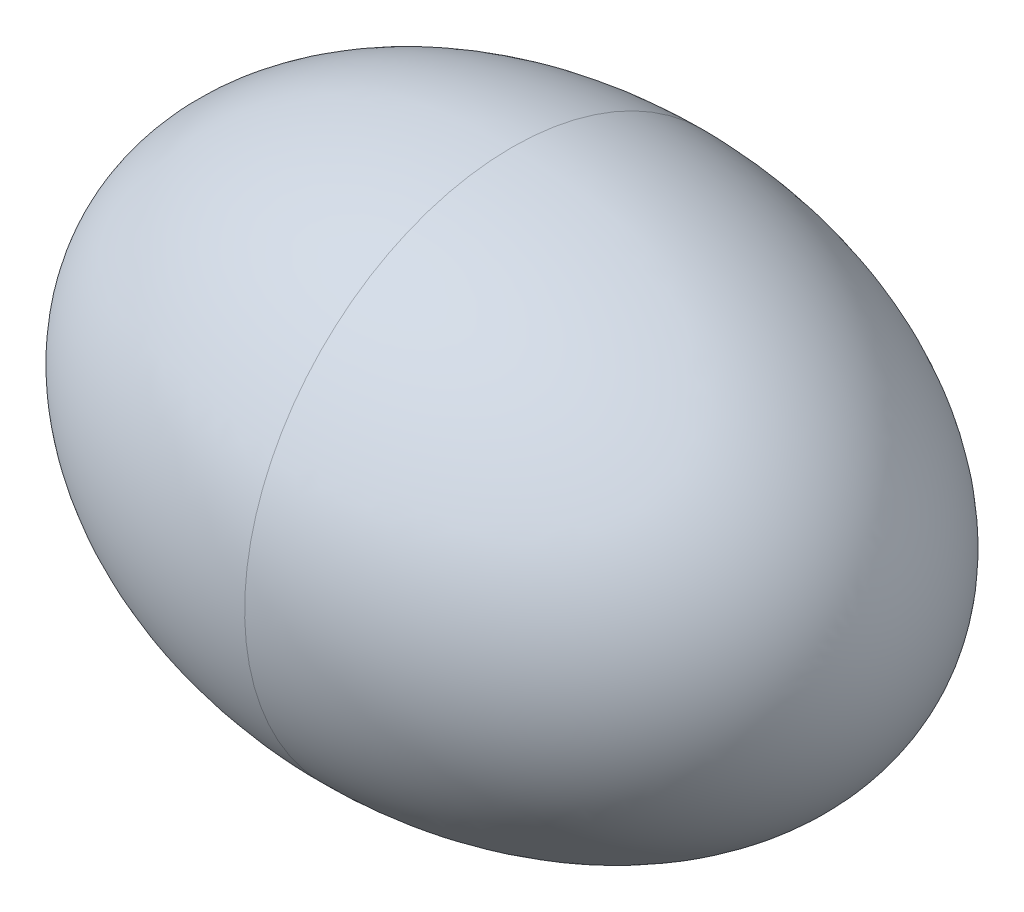
ISO-10303-21;
HEADER;
FILE_DESCRIPTION(('STEP AP214'),'2;1');
FILE_NAME('part.step','',(''),(''),'','','');
FILE_SCHEMA(('AUTOMOTIVE_DESIGN { 1 0 10303 214 1 1 1 1 }'));
ENDSEC;
DATA;
#1=APPLICATION_CONTEXT('core data for automotive mechanical design processes');
#2=APPLICATION_PROTOCOL_DEFINITION('international standard','automotive_design',2000,#1);
#3=PRODUCT_CONTEXT('',#1,'mechanical');
#4=PRODUCT('Part','Part','',(#3));
#5=PRODUCT_RELATED_PRODUCT_CATEGORY('part','',(#4));
#6=PRODUCT_DEFINITION_FORMATION('','',#4);
#7=PRODUCT_DEFINITION_CONTEXT('part definition',#1,'design');
#8=PRODUCT_DEFINITION('design','',#6,#7);
#9=PRODUCT_DEFINITION_SHAPE('','',#8);
#10=(LENGTH_UNIT() NAMED_UNIT(*) SI_UNIT(.MILLI.,.METRE.));
#11=(NAMED_UNIT(*) PLANE_ANGLE_UNIT() SI_UNIT($,.RADIAN.));
#12=(NAMED_UNIT(*) SI_UNIT($,.STERADIAN.) SOLID_ANGLE_UNIT());
#13=UNCERTAINTY_MEASURE_WITH_UNIT(LENGTH_MEASURE(1.E-05),#10,'distance_accuracy_value','');
#14=(GEOMETRIC_REPRESENTATION_CONTEXT(3) GLOBAL_UNCERTAINTY_ASSIGNED_CONTEXT((#13)) GLOBAL_UNIT_ASSIGNED_CONTEXT((#10,
#11,#12)) REPRESENTATION_CONTEXT('',''));
#15=CARTESIAN_POINT('',(0.,0.,0.));
#16=DIRECTION('',(0.,0.,1.));
#17=DIRECTION('',(1.,0.,0.));
#18=AXIS2_PLACEMENT_3D('',#15,#16,#17);
#19=CARTESIAN_POINT('',(-1.40545775468068E-13,22.2339455499378,0.));
#20=CARTESIAN_POINT('',(-0.143762843222983,22.2339455499378,0.));
#21=CARTESIAN_POINT('',(-0.432206157977027,22.2325424407356,0.));
#22=CARTESIAN_POINT('',(-0.910783321987254,22.2262283547854,0.));
#23=CARTESIAN_POINT('',(-1.54889602418794,22.2093875576517,0.));
#24=CARTESIAN_POINT('',(-2.31797260217493,22.1778007006346,0.));
#25=CARTESIAN_POINT('',(-3.23898139578509,22.1230192342212,0.));
#26=CARTESIAN_POINT('',(-4.31999391387804,22.0344368871887,0.));
#27=CARTESIAN_POINT('',(-5.5466492099586,21.8992065662358,0.));
#28=CARTESIAN_POINT('',(-7.07766942043223,21.6874108246379,0.));
#29=CARTESIAN_POINT('',(-8.59849844722757,21.4181599287052,0.));
#30=CARTESIAN_POINT('',(-10.1087507688854,21.0906512541548,0.));
#31=CARTESIAN_POINT('',(-11.9032611610301,20.6264414418171,0.));
#32=CARTESIAN_POINT('',(-13.678194870939,20.0900633294707,0.));
#33=CARTESIAN_POINT('',(-15.4230850198294,19.4614564101096,0.));
#34=CARTESIAN_POINT('',(-17.1302251345697,18.7374131745756,0.));
#35=CARTESIAN_POINT('',(-18.8013122959885,17.9348339551627,0.));
#36=CARTESIAN_POINT('',(-20.4322192086519,17.0522015469717,0.));
#37=CARTESIAN_POINT('',(-22.0103857762163,16.0626740528416,0.));
#38=CARTESIAN_POINT('',(-23.5148945700367,14.9653087835329,0.));
#39=CARTESIAN_POINT('',(-24.7115965183854,13.9764174461085,0.));
#40=CARTESIAN_POINT('',(-25.631207001962,13.139496207104,0.));
#41=CARTESIAN_POINT('',(-26.5028255541288,12.2629095714935,0.));
#42=CARTESIAN_POINT('',(-27.3272176043713,11.341700532943,0.));
#43=CARTESIAN_POINT('',(-28.0993473127541,10.3761754043376,0.));
#44=CARTESIAN_POINT('',(-28.8137928549679,9.36714633511617,0.));
#45=CARTESIAN_POINT('',(-29.4648273205509,8.31597725336157,0.));
#46=CARTESIAN_POINT('',(-30.0464942579159,7.22483571814845,0.));
#47=CARTESIAN_POINT('',(-30.5527875969655,6.09664118320169,0.));
#48=CARTESIAN_POINT('',(-30.9779011012664,4.93531335033573,0.));
#49=CARTESIAN_POINT('',(-31.343391493539,3.65066859803268,0.));
#50=CARTESIAN_POINT('',(-31.6138424907544,2.26742493730803,0.));
#51=CARTESIAN_POINT('',(-31.7241476458254,1.17198002051476,0.));
#52=CARTESIAN_POINT('',(-31.7499929161518,0.38245131237174,0.));
#53=CARTESIAN_POINT('',(-31.75,0.,0.));
#54=B_SPLINE_CURVE_WITH_KNOTS('',4,(#19,#20,#21,#22,#23,#24,#25,#26,#27,#28,#29,#30,#31,#32,#33,
#34,#35,#36,#37,#38,#39,#40,#41,#42,#43,#44,#45,#46,#47,#48,#49,#50,#51,#52,#53),.UNSPECIFIED.,
.F.,.F.,(5,1,1,1,1,1,1,1,1,1,1,1,1,1,1,1,1,1,1,1,1,1,1,1,1,1,1,1,1,1,1,5),(0.0692191309827658,
0.0826772676744145,0.0961354043660632,0.109593541057712,0.123051677749361,0.149967949867397,
0.176884221985434,0.20380049462672,0.230716767268007,0.284549308410349,0.31146558618406,
0.338381863957772,0.392214400747086,0.446046929839078,0.472963203666197,0.499879477493316,
0.553711986834987,0.607544507248194,0.635097733146903,0.662014084872497,0.68893045738854,
0.715846566398897,0.742762860681162,0.769678545161759,0.796594934411025,0.823510314910713,
0.850426801270595,0.877341102378087,0.904254958128799,0.931177170837435,0.966689047498764,1.),.UNSPECIFIED.);
#55=CARTESIAN_POINT('',(31.75,0.,0.));
#56=DIRECTION('',(1.,0.,0.));
#57=AXIS1_PLACEMENT('',#55,#56);
#58=SURFACE_OF_REVOLUTION('',#54,#57);
#59=CARTESIAN_POINT('',(-31.75,0.,0.));
#60=VERTEX_POINT('',#59);
#61=VERTEX_LOOP('',#60);
#62=FACE_BOUND('',#61,.T.);
#63=CARTESIAN_POINT('',(1.38777878078145E-13,0.,0.));
#64=DIRECTION('',(1.,0.,0.));
#65=DIRECTION('',(0.,0.,-1.));
#66=AXIS2_PLACEMENT_3D('',#63,#64,#65);
#67=CIRCLE('',#66,22.2339455499378);
#68=CARTESIAN_POINT('',(1.38777878078145E-13,0.,-22.2339455499378));
#69=VERTEX_POINT('',#68);
#70=EDGE_CURVE('E11',#69,#69,#67,.T.);
#71=ORIENTED_EDGE('',*,*,#70,.F.);
#72=EDGE_LOOP('',(#71));
#73=FACE_BOUND('',#72,.T.);
#74=ADVANCED_FACE('F39',(#62,#73),#58,.F.);
#75=CARTESIAN_POINT('',(31.75,0.,0.));
#76=CARTESIAN_POINT('',(31.7499929161518,0.38245131237174,0.));
#77=CARTESIAN_POINT('',(31.7241476458254,1.17198002051476,0.));
#78=CARTESIAN_POINT('',(31.6138424907544,2.26742493730803,0.));
#79=CARTESIAN_POINT('',(31.343391493539,3.65066859803268,0.));
#80=CARTESIAN_POINT('',(30.9779011012664,4.93531335033573,0.));
#81=CARTESIAN_POINT('',(30.5527875969655,6.09664118320169,0.));
#82=CARTESIAN_POINT('',(30.0464942579159,7.22483571814845,0.));
#83=CARTESIAN_POINT('',(29.4648273205509,8.31597725336157,0.));
#84=CARTESIAN_POINT('',(28.8137928549679,9.36714633511617,0.));
#85=CARTESIAN_POINT('',(28.0993473127541,10.3761754043376,0.));
#86=CARTESIAN_POINT('',(27.3272176043713,11.341700532943,0.));
#87=CARTESIAN_POINT('',(26.5028255541288,12.2629095714935,0.));
#88=CARTESIAN_POINT('',(25.631207001962,13.139496207104,0.));
#89=CARTESIAN_POINT('',(24.7115965183854,13.9764174461085,0.));
#90=CARTESIAN_POINT('',(23.5148945700367,14.9653087835329,0.));
#91=CARTESIAN_POINT('',(22.0103857762163,16.0626740528416,0.));
#92=CARTESIAN_POINT('',(20.4322192086519,17.0522015469717,0.));
#93=CARTESIAN_POINT('',(18.8013122959885,17.9348339551627,0.));
#94=CARTESIAN_POINT('',(17.1302251345697,18.7374131745756,0.));
#95=CARTESIAN_POINT('',(15.4230850198294,19.4614564101096,0.));
#96=CARTESIAN_POINT('',(13.678194870939,20.0900633294707,0.));
#97=CARTESIAN_POINT('',(11.9032611610301,20.6264414418171,0.));
#98=CARTESIAN_POINT('',(10.1087507688854,21.0906512541548,0.));
#99=CARTESIAN_POINT('',(8.59849844722757,21.4181599287052,0.));
#100=CARTESIAN_POINT('',(7.07766942043223,21.6874108246379,0.));
#101=CARTESIAN_POINT('',(5.5466492099586,21.8992065662358,0.));
#102=CARTESIAN_POINT('',(4.31999391387804,22.0344368871887,0.));
#103=CARTESIAN_POINT('',(3.23898139578509,22.1230192342212,0.));
#104=CARTESIAN_POINT('',(2.31797260217493,22.1778007006346,0.));
#105=CARTESIAN_POINT('',(1.54889602418794,22.2093875576517,0.));
#106=CARTESIAN_POINT('',(0.910783321987254,22.2262283547854,0.));
#107=CARTESIAN_POINT('',(0.432206157977027,22.2325424407356,0.));
#108=CARTESIAN_POINT('',(0.143762843222983,22.2339455499378,0.));
#109=CARTESIAN_POINT('',(1.40545775468068E-13,22.2339455499378,0.));
#110=B_SPLINE_CURVE_WITH_KNOTS('',4,(#75,#76,#77,#78,#79,#80,#81,#82,#83,#84,#85,#86,#87,#88,
#89,#90,#91,#92,#93,#94,#95,#96,#97,#98,#99,#100,#101,#102,#103,#104,#105,#106,#107,#108,#109),
.UNSPECIFIED.,.F.,.F.,(5,1,1,1,1,1,1,1,1,1,1,1,1,1,1,1,1,1,1,1,1,1,1,1,1,1,1,1,1,1,1,5),
(0.0692191309827658,0.102530083484002,0.138041960145331,0.164964172853967,0.191878028604679,
0.21879232971217,0.245708816072052,0.272624196571741,0.299540585821007,0.326456270301604,
0.353372564583869,0.380288673594226,0.407205046110269,0.434121397835863,0.461674623734572,
0.515507144147779,0.56933965348945,0.596255927316569,0.623172201143688,0.67700473023568,
0.730837267024994,0.757753544798705,0.784669822572417,0.838502363714759,0.865418636356045,
0.892334908997332,0.919251181115369,0.946167453233405,0.959625589925054,0.973083726616703,
0.986541863308351,1.),.UNSPECIFIED.);
#111=CARTESIAN_POINT('',(31.75,0.,0.));
#112=DIRECTION('',(1.,0.,0.));
#113=AXIS1_PLACEMENT('',#111,#112);
#114=SURFACE_OF_REVOLUTION('',#110,#113);
#115=ORIENTED_EDGE('',*,*,#70,.T.);
#116=EDGE_LOOP('',(#115));
#117=FACE_BOUND('',#116,.T.);
#118=CARTESIAN_POINT('',(31.75,0.,0.));
#119=VERTEX_POINT('',#118);
#120=VERTEX_LOOP('',#119);
#121=FACE_BOUND('',#120,.T.);
#122=ADVANCED_FACE('F55',(#117,#121),#114,.F.);
#123=CLOSED_SHELL('',(#74,#122));
#124=MANIFOLD_SOLID_BREP('B2',#123);
#125=ADVANCED_BREP_SHAPE_REPRESENTATION('',(#18,#124),#14);
#126=SHAPE_DEFINITION_REPRESENTATION(#9,#125);
ENDSEC;
END-ISO-10303-21;
